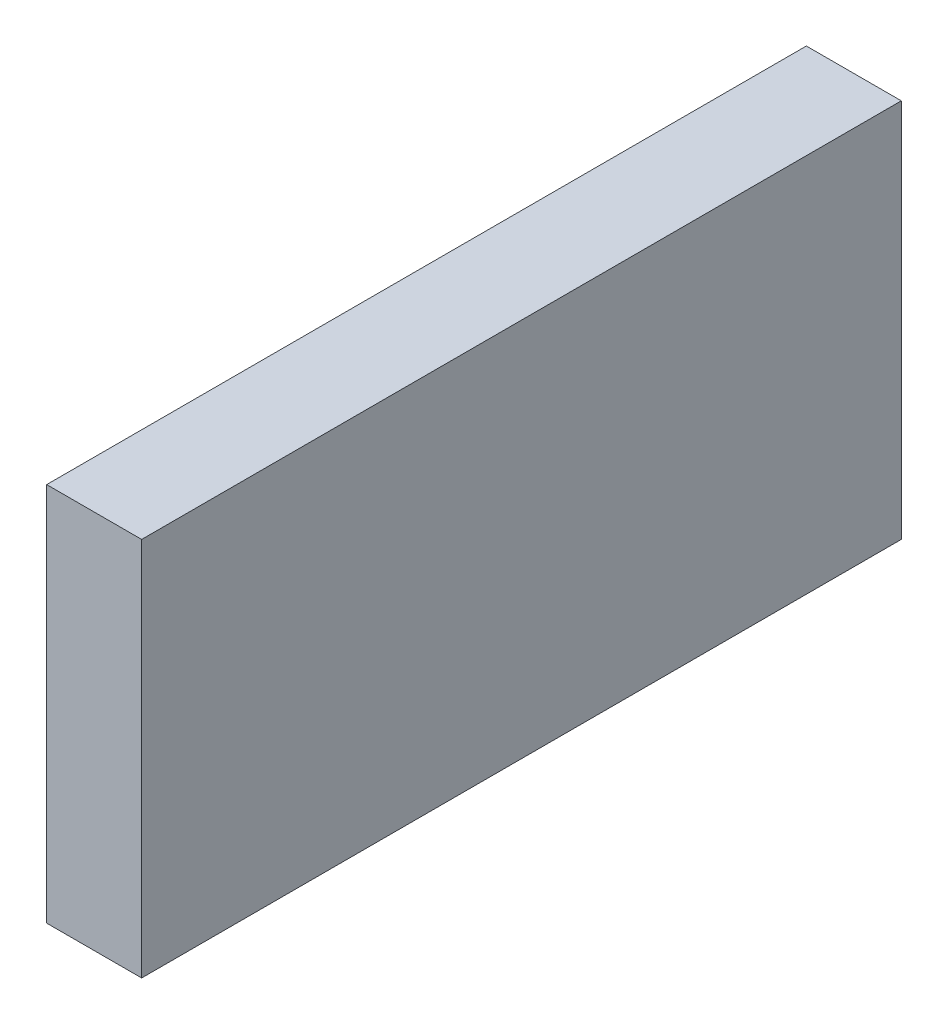
ISO-10303-21;
HEADER;
FILE_DESCRIPTION(('STEP AP214'),'2;1');
FILE_NAME('part.step','',(''),(''),'','','');
FILE_SCHEMA(('AUTOMOTIVE_DESIGN { 1 0 10303 214 1 1 1 1 }'));
ENDSEC;
DATA;
#1=APPLICATION_CONTEXT('core data for automotive mechanical design processes');
#2=APPLICATION_PROTOCOL_DEFINITION('international standard','automotive_design',2000,#1);
#3=PRODUCT_CONTEXT('',#1,'mechanical');
#4=PRODUCT('Part','Part','',(#3));
#5=PRODUCT_RELATED_PRODUCT_CATEGORY('part','',(#4));
#6=PRODUCT_DEFINITION_FORMATION('','',#4);
#7=PRODUCT_DEFINITION_CONTEXT('part definition',#1,'design');
#8=PRODUCT_DEFINITION('design','',#6,#7);
#9=PRODUCT_DEFINITION_SHAPE('','',#8);
#10=(LENGTH_UNIT() NAMED_UNIT(*) SI_UNIT(.MILLI.,.METRE.));
#11=(NAMED_UNIT(*) PLANE_ANGLE_UNIT() SI_UNIT($,.RADIAN.));
#12=(NAMED_UNIT(*) SI_UNIT($,.STERADIAN.) SOLID_ANGLE_UNIT());
#13=UNCERTAINTY_MEASURE_WITH_UNIT(LENGTH_MEASURE(1.E-05),#10,'distance_accuracy_value','');
#14=(GEOMETRIC_REPRESENTATION_CONTEXT(3) GLOBAL_UNCERTAINTY_ASSIGNED_CONTEXT((#13)) GLOBAL_UNIT_ASSIGNED_CONTEXT((#10,
#11,#12)) REPRESENTATION_CONTEXT('',''));
#15=CARTESIAN_POINT('',(0.,0.,0.));
#16=DIRECTION('',(0.,0.,1.));
#17=DIRECTION('',(1.,0.,0.));
#18=AXIS2_PLACEMENT_3D('',#15,#16,#17);
#19=CARTESIAN_POINT('',(0.,0.,50.8));
#20=DIRECTION('',(1.,0.,0.));
#21=DIRECTION('',(0.,0.,-1.));
#22=AXIS2_PLACEMENT_3D('',#19,#20,#21);
#23=PLANE('',#22);
#24=DIRECTION('',(0.,-1.,0.));
#25=VECTOR('',#24,1.);
#26=CARTESIAN_POINT('',(0.,0.,0.));
#27=LINE('',#26,#25);
#28=CARTESIAN_POINT('',(0.,25.4,0.));
#29=VERTEX_POINT('',#28);
#30=CARTESIAN_POINT('',(0.,0.,0.));
#31=VERTEX_POINT('',#30);
#32=EDGE_CURVE('E96',#29,#31,#27,.T.);
#33=ORIENTED_EDGE('',*,*,#32,.T.);
#34=DIRECTION('',(0.,0.,-1.));
#35=VECTOR('',#34,1.);
#36=CARTESIAN_POINT('',(0.,0.,50.8));
#37=LINE('',#36,#35);
#38=CARTESIAN_POINT('',(0.,0.,50.8));
#39=VERTEX_POINT('',#38);
#40=EDGE_CURVE('E11',#39,#31,#37,.T.);
#41=ORIENTED_EDGE('',*,*,#40,.F.);
#42=DIRECTION('',(0.,-1.,0.));
#43=VECTOR('',#42,1.);
#44=CARTESIAN_POINT('',(0.,0.,50.8));
#45=LINE('',#44,#43);
#46=CARTESIAN_POINT('',(0.,25.4,50.8));
#47=VERTEX_POINT('',#46);
#48=EDGE_CURVE('E84',#47,#39,#45,.T.);
#49=ORIENTED_EDGE('',*,*,#48,.F.);
#50=DIRECTION('',(0.,0.,-1.));
#51=VECTOR('',#50,1.);
#52=CARTESIAN_POINT('',(0.,25.4,50.8));
#53=LINE('',#52,#51);
#54=EDGE_CURVE('E92',#47,#29,#53,.T.);
#55=ORIENTED_EDGE('',*,*,#54,.T.);
#56=EDGE_LOOP('',(#33,#41,#49,#55));
#57=FACE_BOUND('',#56,.T.);
#58=ADVANCED_FACE('F33',(#57),#23,.F.);
#59=CARTESIAN_POINT('',(0.,0.,50.8));
#60=DIRECTION('',(0.,1.,0.));
#61=DIRECTION('',(0.,0.,1.));
#62=AXIS2_PLACEMENT_3D('',#59,#60,#61);
#63=PLANE('',#62);
#64=DIRECTION('',(1.,0.,0.));
#65=VECTOR('',#64,1.);
#66=CARTESIAN_POINT('',(0.,0.,0.));
#67=LINE('',#66,#65);
#68=CARTESIAN_POINT('',(6.35,0.,0.));
#69=VERTEX_POINT('',#68);
#70=EDGE_CURVE('E88',#31,#69,#67,.T.);
#71=ORIENTED_EDGE('',*,*,#70,.T.);
#72=DIRECTION('',(0.,0.,-1.));
#73=VECTOR('',#72,1.);
#74=CARTESIAN_POINT('',(6.35,0.,50.8));
#75=LINE('',#74,#73);
#76=CARTESIAN_POINT('',(6.35,0.,50.8));
#77=VERTEX_POINT('',#76);
#78=EDGE_CURVE('E41',#77,#69,#75,.T.);
#79=ORIENTED_EDGE('',*,*,#78,.F.);
#80=DIRECTION('',(1.,0.,0.));
#81=VECTOR('',#80,1.);
#82=CARTESIAN_POINT('',(0.,0.,50.8));
#83=LINE('',#82,#81);
#84=EDGE_CURVE('E79',#39,#77,#83,.T.);
#85=ORIENTED_EDGE('',*,*,#84,.F.);
#86=ORIENTED_EDGE('',*,*,#40,.T.);
#87=EDGE_LOOP('',(#71,#79,#85,#86));
#88=FACE_BOUND('',#87,.T.);
#89=ADVANCED_FACE('F87',(#88),#63,.F.);
#90=CARTESIAN_POINT('',(6.35,0.,50.8));
#91=DIRECTION('',(-1.,0.,0.));
#92=DIRECTION('',(0.,0.,1.));
#93=AXIS2_PLACEMENT_3D('',#90,#91,#92);
#94=PLANE('',#93);
#95=DIRECTION('',(0.,1.,0.));
#96=VECTOR('',#95,1.);
#97=CARTESIAN_POINT('',(6.35,0.,0.));
#98=LINE('',#97,#96);
#99=CARTESIAN_POINT('',(6.35,25.4,0.));
#100=VERTEX_POINT('',#99);
#101=EDGE_CURVE('E66',#69,#100,#98,.T.);
#102=ORIENTED_EDGE('',*,*,#101,.T.);
#103=DIRECTION('',(0.,0.,-1.));
#104=VECTOR('',#103,1.);
#105=CARTESIAN_POINT('',(6.35,25.4,50.8));
#106=LINE('',#105,#104);
#107=CARTESIAN_POINT('',(6.35,25.4,50.8));
#108=VERTEX_POINT('',#107);
#109=EDGE_CURVE('E89',#108,#100,#106,.T.);
#110=ORIENTED_EDGE('',*,*,#109,.F.);
#111=DIRECTION('',(0.,1.,0.));
#112=VECTOR('',#111,1.);
#113=CARTESIAN_POINT('',(6.35,0.,50.8));
#114=LINE('',#113,#112);
#115=EDGE_CURVE('E82',#77,#108,#114,.T.);
#116=ORIENTED_EDGE('',*,*,#115,.F.);
#117=ORIENTED_EDGE('',*,*,#78,.T.);
#118=EDGE_LOOP('',(#102,#110,#116,#117));
#119=FACE_BOUND('',#118,.T.);
#120=ADVANCED_FACE('F90',(#119),#94,.F.);
#121=CARTESIAN_POINT('',(0.,25.4,50.8));
#122=DIRECTION('',(0.,-1.,0.));
#123=DIRECTION('',(0.,0.,-1.));
#124=AXIS2_PLACEMENT_3D('',#121,#122,#123);
#125=PLANE('',#124);
#126=DIRECTION('',(-1.,0.,0.));
#127=VECTOR('',#126,1.);
#128=CARTESIAN_POINT('',(0.,25.4,0.));
#129=LINE('',#128,#127);
#130=EDGE_CURVE('E72',#100,#29,#129,.T.);
#131=ORIENTED_EDGE('',*,*,#130,.T.);
#132=ORIENTED_EDGE('',*,*,#54,.F.);
#133=DIRECTION('',(-1.,0.,0.));
#134=VECTOR('',#133,1.);
#135=CARTESIAN_POINT('',(0.,25.4,50.8));
#136=LINE('',#135,#134);
#137=EDGE_CURVE('E49',#108,#47,#136,.T.);
#138=ORIENTED_EDGE('',*,*,#137,.F.);
#139=ORIENTED_EDGE('',*,*,#109,.T.);
#140=EDGE_LOOP('',(#131,#132,#138,#139));
#141=FACE_BOUND('',#140,.T.);
#142=ADVANCED_FACE('F103',(#141),#125,.F.);
#143=CARTESIAN_POINT('',(0.,0.,50.8));
#144=DIRECTION('',(0.,0.,-1.));
#145=DIRECTION('',(-1.,0.,0.));
#146=AXIS2_PLACEMENT_3D('',#143,#144,#145);
#147=PLANE('',#146);
#148=ORIENTED_EDGE('',*,*,#48,.T.);
#149=ORIENTED_EDGE('',*,*,#84,.T.);
#150=ORIENTED_EDGE('',*,*,#115,.T.);
#151=ORIENTED_EDGE('',*,*,#137,.T.);
#152=EDGE_LOOP('',(#148,#149,#150,#151));
#153=FACE_BOUND('',#152,.T.);
#154=ADVANCED_FACE('F80',(#153),#147,.F.);
#155=CARTESIAN_POINT('',(0.,0.,0.));
#156=DIRECTION('',(0.,0.,-1.));
#157=DIRECTION('',(-1.,0.,0.));
#158=AXIS2_PLACEMENT_3D('',#155,#156,#157);
#159=PLANE('',#158);
#160=ORIENTED_EDGE('',*,*,#32,.F.);
#161=ORIENTED_EDGE('',*,*,#130,.F.);
#162=ORIENTED_EDGE('',*,*,#101,.F.);
#163=ORIENTED_EDGE('',*,*,#70,.F.);
#164=EDGE_LOOP('',(#160,#161,#162,#163));
#165=FACE_BOUND('',#164,.T.);
#166=ADVANCED_FACE('F106',(#165),#159,.T.);
#167=CLOSED_SHELL('',(#58,#89,#120,#142,#154,#166));
#168=MANIFOLD_SOLID_BREP('B2',#167);
#169=ADVANCED_BREP_SHAPE_REPRESENTATION('',(#18,#168),#14);
#170=SHAPE_DEFINITION_REPRESENTATION(#9,#169);
ENDSEC;
END-ISO-10303-21;
